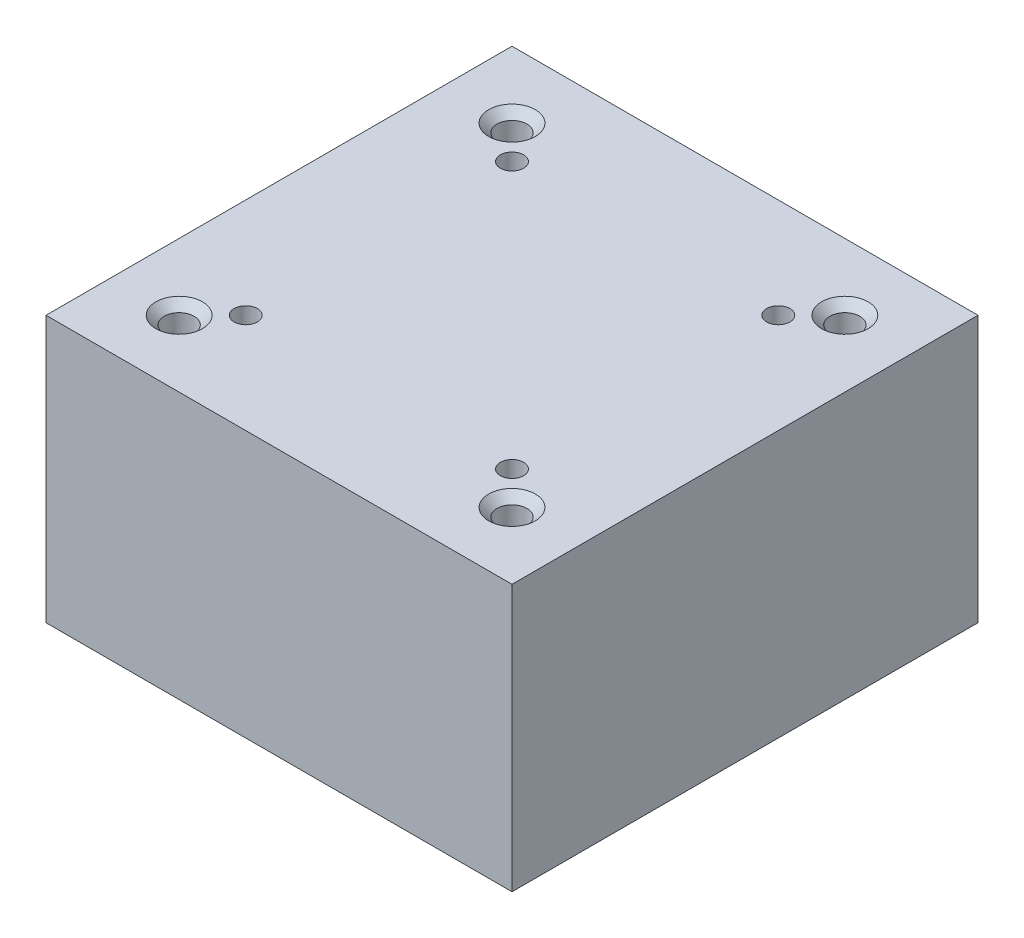
ISO-10303-21;
HEADER;
FILE_DESCRIPTION(('STEP AP214'),'2;1');
FILE_NAME('part.step','',(''),(''),'','','');
FILE_SCHEMA(('AUTOMOTIVE_DESIGN { 1 0 10303 214 1 1 1 1 }'));
ENDSEC;
DATA;
#1=APPLICATION_CONTEXT('core data for automotive mechanical design processes');
#2=APPLICATION_PROTOCOL_DEFINITION('international standard','automotive_design',2000,#1);
#3=PRODUCT_CONTEXT('',#1,'mechanical');
#4=PRODUCT('Part','Part','',(#3));
#5=PRODUCT_RELATED_PRODUCT_CATEGORY('part','',(#4));
#6=PRODUCT_DEFINITION_FORMATION('','',#4);
#7=PRODUCT_DEFINITION_CONTEXT('part definition',#1,'design');
#8=PRODUCT_DEFINITION('design','',#6,#7);
#9=PRODUCT_DEFINITION_SHAPE('','',#8);
#10=(LENGTH_UNIT() NAMED_UNIT(*) SI_UNIT(.MILLI.,.METRE.));
#11=(NAMED_UNIT(*) PLANE_ANGLE_UNIT() SI_UNIT($,.RADIAN.));
#12=(NAMED_UNIT(*) SI_UNIT($,.STERADIAN.) SOLID_ANGLE_UNIT());
#13=UNCERTAINTY_MEASURE_WITH_UNIT(LENGTH_MEASURE(1.E-05),#10,'distance_accuracy_value','');
#14=(GEOMETRIC_REPRESENTATION_CONTEXT(3) GLOBAL_UNCERTAINTY_ASSIGNED_CONTEXT((#13)) GLOBAL_UNIT_ASSIGNED_CONTEXT((#10,
#11,#12)) REPRESENTATION_CONTEXT('',''));
#15=CARTESIAN_POINT('',(0.,0.,0.));
#16=DIRECTION('',(0.,0.,1.));
#17=DIRECTION('',(1.,0.,0.));
#18=AXIS2_PLACEMENT_3D('',#15,#16,#17);
#19=CARTESIAN_POINT('',(-70.,80.,-70.));
#20=DIRECTION('',(1.,0.,0.));
#21=DIRECTION('',(0.,0.,-1.));
#22=AXIS2_PLACEMENT_3D('',#19,#20,#21);
#23=PLANE('',#22);
#24=DIRECTION('',(0.,0.,1.));
#25=VECTOR('',#24,1.);
#26=CARTESIAN_POINT('',(-70.,0.,-70.));
#27=LINE('',#26,#25);
#28=CARTESIAN_POINT('',(-70.,0.,-70.));
#29=VERTEX_POINT('',#28);
#30=CARTESIAN_POINT('',(-70.,0.,70.));
#31=VERTEX_POINT('',#30);
#32=EDGE_CURVE('E172',#29,#31,#27,.T.);
#33=ORIENTED_EDGE('',*,*,#32,.T.);
#34=DIRECTION('',(0.,-1.,0.));
#35=VECTOR('',#34,1.);
#36=CARTESIAN_POINT('',(-70.,80.,70.));
#37=LINE('',#36,#35);
#38=CARTESIAN_POINT('',(-70.,80.,70.));
#39=VERTEX_POINT('',#38);
#40=EDGE_CURVE('E11',#39,#31,#37,.T.);
#41=ORIENTED_EDGE('',*,*,#40,.F.);
#42=DIRECTION('',(0.,0.,1.));
#43=VECTOR('',#42,1.);
#44=CARTESIAN_POINT('',(-70.,80.,-70.));
#45=LINE('',#44,#43);
#46=CARTESIAN_POINT('',(-70.,80.,-70.));
#47=VERTEX_POINT('',#46);
#48=EDGE_CURVE('E174',#47,#39,#45,.T.);
#49=ORIENTED_EDGE('',*,*,#48,.F.);
#50=DIRECTION('',(0.,-1.,0.));
#51=VECTOR('',#50,1.);
#52=CARTESIAN_POINT('',(-70.,80.,-70.));
#53=LINE('',#52,#51);
#54=EDGE_CURVE('E181',#47,#29,#53,.T.);
#55=ORIENTED_EDGE('',*,*,#54,.T.);
#56=EDGE_LOOP('',(#33,#41,#49,#55));
#57=FACE_BOUND('',#56,.T.);
#58=ADVANCED_FACE('F44',(#57),#23,.F.);
#59=CARTESIAN_POINT('',(-70.,80.,70.));
#60=DIRECTION('',(0.,0.,-1.));
#61=DIRECTION('',(-1.,0.,0.));
#62=AXIS2_PLACEMENT_3D('',#59,#60,#61);
#63=PLANE('',#62);
#64=DIRECTION('',(1.,0.,0.));
#65=VECTOR('',#64,1.);
#66=CARTESIAN_POINT('',(-70.,0.,70.));
#67=LINE('',#66,#65);
#68=CARTESIAN_POINT('',(70.,0.,70.));
#69=VERTEX_POINT('',#68);
#70=EDGE_CURVE('E183',#31,#69,#67,.T.);
#71=ORIENTED_EDGE('',*,*,#70,.T.);
#72=DIRECTION('',(0.,-1.,0.));
#73=VECTOR('',#72,1.);
#74=CARTESIAN_POINT('',(70.,80.,70.));
#75=LINE('',#74,#73);
#76=CARTESIAN_POINT('',(70.,80.,70.));
#77=VERTEX_POINT('',#76);
#78=EDGE_CURVE('E52',#77,#69,#75,.T.);
#79=ORIENTED_EDGE('',*,*,#78,.F.);
#80=DIRECTION('',(1.,0.,0.));
#81=VECTOR('',#80,1.);
#82=CARTESIAN_POINT('',(-70.,80.,70.));
#83=LINE('',#82,#81);
#84=EDGE_CURVE('E95',#39,#77,#83,.T.);
#85=ORIENTED_EDGE('',*,*,#84,.F.);
#86=ORIENTED_EDGE('',*,*,#40,.T.);
#87=EDGE_LOOP('',(#71,#79,#85,#86));
#88=FACE_BOUND('',#87,.T.);
#89=ADVANCED_FACE('F209',(#88),#63,.F.);
#90=CARTESIAN_POINT('',(70.,80.,-70.));
#91=DIRECTION('',(-1.,0.,0.));
#92=DIRECTION('',(0.,0.,1.));
#93=AXIS2_PLACEMENT_3D('',#90,#91,#92);
#94=PLANE('',#93);
#95=DIRECTION('',(0.,0.,-1.));
#96=VECTOR('',#95,1.);
#97=CARTESIAN_POINT('',(70.,0.,-70.));
#98=LINE('',#97,#96);
#99=CARTESIAN_POINT('',(70.,0.,-70.));
#100=VERTEX_POINT('',#99);
#101=EDGE_CURVE('E79',#69,#100,#98,.T.);
#102=ORIENTED_EDGE('',*,*,#101,.T.);
#103=DIRECTION('',(0.,-1.,0.));
#104=VECTOR('',#103,1.);
#105=CARTESIAN_POINT('',(70.,80.,-70.));
#106=LINE('',#105,#104);
#107=CARTESIAN_POINT('',(70.,80.,-70.));
#108=VERTEX_POINT('',#107);
#109=EDGE_CURVE('E186',#108,#100,#106,.T.);
#110=ORIENTED_EDGE('',*,*,#109,.F.);
#111=DIRECTION('',(0.,0.,-1.));
#112=VECTOR('',#111,1.);
#113=CARTESIAN_POINT('',(70.,80.,-70.));
#114=LINE('',#113,#112);
#115=EDGE_CURVE('E178',#77,#108,#114,.T.);
#116=ORIENTED_EDGE('',*,*,#115,.F.);
#117=ORIENTED_EDGE('',*,*,#78,.T.);
#118=EDGE_LOOP('',(#102,#110,#116,#117));
#119=FACE_BOUND('',#118,.T.);
#120=ADVANCED_FACE('F191',(#119),#94,.F.);
#121=CARTESIAN_POINT('',(-70.,80.,-70.));
#122=DIRECTION('',(0.,0.,1.));
#123=DIRECTION('',(1.,0.,0.));
#124=AXIS2_PLACEMENT_3D('',#121,#122,#123);
#125=PLANE('',#124);
#126=DIRECTION('',(-1.,0.,0.));
#127=VECTOR('',#126,1.);
#128=CARTESIAN_POINT('',(-70.,0.,-70.));
#129=LINE('',#128,#127);
#130=EDGE_CURVE('E85',#100,#29,#129,.T.);
#131=ORIENTED_EDGE('',*,*,#130,.T.);
#132=ORIENTED_EDGE('',*,*,#54,.F.);
#133=DIRECTION('',(-1.,0.,0.));
#134=VECTOR('',#133,1.);
#135=CARTESIAN_POINT('',(-70.,80.,-70.));
#136=LINE('',#135,#134);
#137=EDGE_CURVE('E61',#108,#47,#136,.T.);
#138=ORIENTED_EDGE('',*,*,#137,.F.);
#139=ORIENTED_EDGE('',*,*,#109,.T.);
#140=EDGE_LOOP('',(#131,#132,#138,#139));
#141=FACE_BOUND('',#140,.T.);
#142=ADVANCED_FACE('F198',(#141),#125,.F.);
#143=CARTESIAN_POINT('',(0.,80.,0.));
#144=DIRECTION('',(0.,1.,0.));
#145=DIRECTION('',(0.,0.,1.));
#146=AXIS2_PLACEMENT_3D('',#143,#144,#145);
#147=PLANE('',#146);
#148=CARTESIAN_POINT('',(-40.,80.,40.));
#149=DIRECTION('',(0.,1.,0.));
#150=DIRECTION('',(0.,0.,1.));
#151=AXIS2_PLACEMENT_3D('',#148,#149,#150);
#152=CIRCLE('',#151,3.49999999999999);
#153=CARTESIAN_POINT('',(-40.,80.,43.5));
#154=VERTEX_POINT('',#153);
#155=EDGE_CURVE('E116',#154,#154,#152,.T.);
#156=ORIENTED_EDGE('',*,*,#155,.F.);
#157=EDGE_LOOP('',(#156));
#158=FACE_BOUND('',#157,.T.);
#159=CARTESIAN_POINT('',(40.,80.,-40.));
#160=DIRECTION('',(0.,1.,0.));
#161=DIRECTION('',(0.,0.,1.));
#162=AXIS2_PLACEMENT_3D('',#159,#160,#161);
#163=CIRCLE('',#162,3.49999999999999);
#164=CARTESIAN_POINT('',(40.,80.,-36.5));
#165=VERTEX_POINT('',#164);
#166=EDGE_CURVE('E114',#165,#165,#163,.T.);
#167=ORIENTED_EDGE('',*,*,#166,.F.);
#168=EDGE_LOOP('',(#167));
#169=FACE_BOUND('',#168,.T.);
#170=CARTESIAN_POINT('',(-40.,80.,-40.));
#171=DIRECTION('',(0.,1.,0.));
#172=DIRECTION('',(0.,0.,1.));
#173=AXIS2_PLACEMENT_3D('',#170,#171,#172);
#174=CIRCLE('',#173,3.49999999999999);
#175=CARTESIAN_POINT('',(-40.,80.,-36.5));
#176=VERTEX_POINT('',#175);
#177=EDGE_CURVE('E126',#176,#176,#174,.T.);
#178=ORIENTED_EDGE('',*,*,#177,.F.);
#179=EDGE_LOOP('',(#178));
#180=FACE_BOUND('',#179,.T.);
#181=CARTESIAN_POINT('',(40.,80.,40.));
#182=DIRECTION('',(0.,1.,0.));
#183=DIRECTION('',(0.,0.,1.));
#184=AXIS2_PLACEMENT_3D('',#181,#182,#183);
#185=CIRCLE('',#184,3.49999999999999);
#186=CARTESIAN_POINT('',(40.,80.,43.5));
#187=VERTEX_POINT('',#186);
#188=EDGE_CURVE('E135',#187,#187,#185,.T.);
#189=ORIENTED_EDGE('',*,*,#188,.F.);
#190=EDGE_LOOP('',(#189));
#191=FACE_BOUND('',#190,.T.);
#192=CARTESIAN_POINT('',(-50.,80.,50.));
#193=DIRECTION('',(0.,1.,0.));
#194=DIRECTION('',(0.,0.,1.));
#195=AXIS2_PLACEMENT_3D('',#192,#193,#194);
#196=CIRCLE('',#195,7.);
#197=CARTESIAN_POINT('',(-50.,80.,57.));
#198=VERTEX_POINT('',#197);
#199=EDGE_CURVE('E139',#198,#198,#196,.T.);
#200=ORIENTED_EDGE('',*,*,#199,.F.);
#201=EDGE_LOOP('',(#200));
#202=FACE_BOUND('',#201,.T.);
#203=CARTESIAN_POINT('',(50.,80.,-50.));
#204=DIRECTION('',(0.,1.,0.));
#205=DIRECTION('',(0.,0.,1.));
#206=AXIS2_PLACEMENT_3D('',#203,#204,#205);
#207=CIRCLE('',#206,7.);
#208=CARTESIAN_POINT('',(50.,80.,-43.));
#209=VERTEX_POINT('',#208);
#210=EDGE_CURVE('E147',#209,#209,#207,.T.);
#211=ORIENTED_EDGE('',*,*,#210,.F.);
#212=EDGE_LOOP('',(#211));
#213=FACE_BOUND('',#212,.T.);
#214=CARTESIAN_POINT('',(-50.,80.,-50.));
#215=DIRECTION('',(0.,1.,0.));
#216=DIRECTION('',(0.,0.,1.));
#217=AXIS2_PLACEMENT_3D('',#214,#215,#216);
#218=CIRCLE('',#217,7.);
#219=CARTESIAN_POINT('',(-50.,80.,-43.));
#220=VERTEX_POINT('',#219);
#221=EDGE_CURVE('E157',#220,#220,#218,.T.);
#222=ORIENTED_EDGE('',*,*,#221,.F.);
#223=EDGE_LOOP('',(#222));
#224=FACE_BOUND('',#223,.T.);
#225=CARTESIAN_POINT('',(50.,80.,50.));
#226=DIRECTION('',(0.,1.,0.));
#227=DIRECTION('',(0.,0.,1.));
#228=AXIS2_PLACEMENT_3D('',#225,#226,#227);
#229=CIRCLE('',#228,7.);
#230=CARTESIAN_POINT('',(50.,80.,57.));
#231=VERTEX_POINT('',#230);
#232=EDGE_CURVE('E164',#231,#231,#229,.T.);
#233=ORIENTED_EDGE('',*,*,#232,.F.);
#234=EDGE_LOOP('',(#233));
#235=FACE_BOUND('',#234,.T.);
#236=ORIENTED_EDGE('',*,*,#48,.T.);
#237=ORIENTED_EDGE('',*,*,#84,.T.);
#238=ORIENTED_EDGE('',*,*,#115,.T.);
#239=ORIENTED_EDGE('',*,*,#137,.T.);
#240=EDGE_LOOP('',(#236,#237,#238,#239));
#241=FACE_BOUND('',#240,.T.);
#242=ADVANCED_FACE('F199',(#158,#169,#180,#191,#202,#213,#224,#235,#241),#147,.T.);
#243=CARTESIAN_POINT('',(0.,0.,0.));
#244=DIRECTION('',(0.,1.,0.));
#245=DIRECTION('',(0.,0.,1.));
#246=AXIS2_PLACEMENT_3D('',#243,#244,#245);
#247=PLANE('',#246);
#248=CARTESIAN_POINT('',(-50.,0.,50.));
#249=DIRECTION('',(0.,1.,0.));
#250=DIRECTION('',(0.,0.,1.));
#251=AXIS2_PLACEMENT_3D('',#248,#249,#250);
#252=CIRCLE('',#251,4.49999999999999);
#253=CARTESIAN_POINT('',(-50.,0.,54.5));
#254=VERTEX_POINT('',#253);
#255=EDGE_CURVE('E144',#254,#254,#252,.T.);
#256=ORIENTED_EDGE('',*,*,#255,.T.);
#257=EDGE_LOOP('',(#256));
#258=FACE_BOUND('',#257,.T.);
#259=CARTESIAN_POINT('',(50.,0.,-50.));
#260=DIRECTION('',(0.,1.,0.));
#261=DIRECTION('',(0.,0.,1.));
#262=AXIS2_PLACEMENT_3D('',#259,#260,#261);
#263=CIRCLE('',#262,4.49999999999999);
#264=CARTESIAN_POINT('',(50.,0.,-45.5));
#265=VERTEX_POINT('',#264);
#266=EDGE_CURVE('E153',#265,#265,#263,.T.);
#267=ORIENTED_EDGE('',*,*,#266,.T.);
#268=EDGE_LOOP('',(#267));
#269=FACE_BOUND('',#268,.T.);
#270=CARTESIAN_POINT('',(-50.,0.,-50.));
#271=DIRECTION('',(0.,1.,0.));
#272=DIRECTION('',(0.,0.,1.));
#273=AXIS2_PLACEMENT_3D('',#270,#271,#272);
#274=CIRCLE('',#273,4.49999999999999);
#275=CARTESIAN_POINT('',(-50.,0.,-45.5));
#276=VERTEX_POINT('',#275);
#277=EDGE_CURVE('E162',#276,#276,#274,.T.);
#278=ORIENTED_EDGE('',*,*,#277,.T.);
#279=EDGE_LOOP('',(#278));
#280=FACE_BOUND('',#279,.T.);
#281=CARTESIAN_POINT('',(50.,0.,50.));
#282=DIRECTION('',(0.,1.,0.));
#283=DIRECTION('',(0.,0.,1.));
#284=AXIS2_PLACEMENT_3D('',#281,#282,#283);
#285=CIRCLE('',#284,4.49999999999999);
#286=CARTESIAN_POINT('',(50.,0.,54.5));
#287=VERTEX_POINT('',#286);
#288=EDGE_CURVE('E171',#287,#287,#285,.T.);
#289=ORIENTED_EDGE('',*,*,#288,.T.);
#290=EDGE_LOOP('',(#289));
#291=FACE_BOUND('',#290,.T.);
#292=ORIENTED_EDGE('',*,*,#32,.F.);
#293=ORIENTED_EDGE('',*,*,#130,.F.);
#294=ORIENTED_EDGE('',*,*,#101,.F.);
#295=ORIENTED_EDGE('',*,*,#70,.F.);
#296=EDGE_LOOP('',(#292,#293,#294,#295));
#297=FACE_BOUND('',#296,.T.);
#298=ADVANCED_FACE('F193',(#258,#269,#280,#291,#297),#247,.F.);
#299=CARTESIAN_POINT('',(50.,80.,50.));
#300=DIRECTION('',(0.,1.,0.));
#301=DIRECTION('',(0.,0.,1.));
#302=AXIS2_PLACEMENT_3D('',#299,#300,#301);
#303=CYLINDRICAL_SURFACE('',#302,4.49999999999999);
#304=ORIENTED_EDGE('',*,*,#288,.F.);
#305=EDGE_LOOP('',(#304));
#306=FACE_BOUND('',#305,.T.);
#307=CARTESIAN_POINT('',(50.,77.5,50.));
#308=DIRECTION('',(0.,1.,0.));
#309=DIRECTION('',(0.,0.,1.));
#310=AXIS2_PLACEMENT_3D('',#307,#308,#309);
#311=CIRCLE('',#310,4.49999999999999);
#312=CARTESIAN_POINT('',(50.,77.5,54.5));
#313=VERTEX_POINT('',#312);
#314=EDGE_CURVE('E166',#313,#313,#311,.T.);
#315=ORIENTED_EDGE('',*,*,#314,.T.);
#316=EDGE_LOOP('',(#315));
#317=FACE_BOUND('',#316,.T.);
#318=ADVANCED_FACE('F246',(#306,#317),#303,.F.);
#319=CARTESIAN_POINT('',(50.,80.,50.));
#320=DIRECTION('',(0.,1.,0.));
#321=DIRECTION('',(0.,0.,1.));
#322=AXIS2_PLACEMENT_3D('',#319,#320,#321);
#323=CONICAL_SURFACE('',#322,7.,0.785398163397452);
#324=ORIENTED_EDGE('',*,*,#314,.F.);
#325=EDGE_LOOP('',(#324));
#326=FACE_BOUND('',#325,.T.);
#327=ORIENTED_EDGE('',*,*,#232,.T.);
#328=EDGE_LOOP('',(#327));
#329=FACE_BOUND('',#328,.T.);
#330=ADVANCED_FACE('F253',(#326,#329),#323,.F.);
#331=CARTESIAN_POINT('',(-50.,80.,-50.));
#332=DIRECTION('',(0.,1.,0.));
#333=DIRECTION('',(0.,0.,1.));
#334=AXIS2_PLACEMENT_3D('',#331,#332,#333);
#335=CYLINDRICAL_SURFACE('',#334,4.49999999999999);
#336=ORIENTED_EDGE('',*,*,#277,.F.);
#337=EDGE_LOOP('',(#336));
#338=FACE_BOUND('',#337,.T.);
#339=CARTESIAN_POINT('',(-50.,77.5,-50.));
#340=DIRECTION('',(0.,1.,0.));
#341=DIRECTION('',(0.,0.,1.));
#342=AXIS2_PLACEMENT_3D('',#339,#340,#341);
#343=CIRCLE('',#342,4.49999999999999);
#344=CARTESIAN_POINT('',(-50.,77.5,-45.5));
#345=VERTEX_POINT('',#344);
#346=EDGE_CURVE('E156',#345,#345,#343,.T.);
#347=ORIENTED_EDGE('',*,*,#346,.T.);
#348=EDGE_LOOP('',(#347));
#349=FACE_BOUND('',#348,.T.);
#350=ADVANCED_FACE('F264',(#338,#349),#335,.F.);
#351=CARTESIAN_POINT('',(-50.,80.,-50.));
#352=DIRECTION('',(0.,1.,0.));
#353=DIRECTION('',(0.,0.,1.));
#354=AXIS2_PLACEMENT_3D('',#351,#352,#353);
#355=CONICAL_SURFACE('',#354,7.,0.785398163397452);
#356=ORIENTED_EDGE('',*,*,#346,.F.);
#357=EDGE_LOOP('',(#356));
#358=FACE_BOUND('',#357,.T.);
#359=ORIENTED_EDGE('',*,*,#221,.T.);
#360=EDGE_LOOP('',(#359));
#361=FACE_BOUND('',#360,.T.);
#362=ADVANCED_FACE('F273',(#358,#361),#355,.F.);
#363=CARTESIAN_POINT('',(50.,80.,-50.));
#364=DIRECTION('',(0.,1.,0.));
#365=DIRECTION('',(0.,0.,1.));
#366=AXIS2_PLACEMENT_3D('',#363,#364,#365);
#367=CYLINDRICAL_SURFACE('',#366,4.49999999999999);
#368=ORIENTED_EDGE('',*,*,#266,.F.);
#369=EDGE_LOOP('',(#368));
#370=FACE_BOUND('',#369,.T.);
#371=CARTESIAN_POINT('',(50.,77.5,-50.));
#372=DIRECTION('',(0.,1.,0.));
#373=DIRECTION('',(0.,0.,1.));
#374=AXIS2_PLACEMENT_3D('',#371,#372,#373);
#375=CIRCLE('',#374,4.49999999999999);
#376=CARTESIAN_POINT('',(50.,77.5,-45.5));
#377=VERTEX_POINT('',#376);
#378=EDGE_CURVE('E150',#377,#377,#375,.T.);
#379=ORIENTED_EDGE('',*,*,#378,.T.);
#380=EDGE_LOOP('',(#379));
#381=FACE_BOUND('',#380,.T.);
#382=ADVANCED_FACE('F284',(#370,#381),#367,.F.);
#383=CARTESIAN_POINT('',(50.,80.,-50.));
#384=DIRECTION('',(0.,1.,0.));
#385=DIRECTION('',(0.,0.,1.));
#386=AXIS2_PLACEMENT_3D('',#383,#384,#385);
#387=CONICAL_SURFACE('',#386,7.,0.785398163397452);
#388=ORIENTED_EDGE('',*,*,#378,.F.);
#389=EDGE_LOOP('',(#388));
#390=FACE_BOUND('',#389,.T.);
#391=ORIENTED_EDGE('',*,*,#210,.T.);
#392=EDGE_LOOP('',(#391));
#393=FACE_BOUND('',#392,.T.);
#394=ADVANCED_FACE('F294',(#390,#393),#387,.F.);
#395=CARTESIAN_POINT('',(-50.,80.,50.));
#396=DIRECTION('',(0.,1.,0.));
#397=DIRECTION('',(0.,0.,1.));
#398=AXIS2_PLACEMENT_3D('',#395,#396,#397);
#399=CYLINDRICAL_SURFACE('',#398,4.49999999999999);
#400=ORIENTED_EDGE('',*,*,#255,.F.);
#401=EDGE_LOOP('',(#400));
#402=FACE_BOUND('',#401,.T.);
#403=CARTESIAN_POINT('',(-50.,77.5,50.));
#404=DIRECTION('',(0.,1.,0.));
#405=DIRECTION('',(0.,0.,1.));
#406=AXIS2_PLACEMENT_3D('',#403,#404,#405);
#407=CIRCLE('',#406,4.49999999999999);
#408=CARTESIAN_POINT('',(-50.,77.5,54.5));
#409=VERTEX_POINT('',#408);
#410=EDGE_CURVE('E142',#409,#409,#407,.T.);
#411=ORIENTED_EDGE('',*,*,#410,.T.);
#412=EDGE_LOOP('',(#411));
#413=FACE_BOUND('',#412,.T.);
#414=ADVANCED_FACE('F304',(#402,#413),#399,.F.);
#415=CARTESIAN_POINT('',(-50.,80.,50.));
#416=DIRECTION('',(0.,1.,0.));
#417=DIRECTION('',(0.,0.,1.));
#418=AXIS2_PLACEMENT_3D('',#415,#416,#417);
#419=CONICAL_SURFACE('',#418,7.,0.785398163397452);
#420=ORIENTED_EDGE('',*,*,#410,.F.);
#421=EDGE_LOOP('',(#420));
#422=FACE_BOUND('',#421,.T.);
#423=ORIENTED_EDGE('',*,*,#199,.T.);
#424=EDGE_LOOP('',(#423));
#425=FACE_BOUND('',#424,.T.);
#426=ADVANCED_FACE('F314',(#422,#425),#419,.F.);
#427=CARTESIAN_POINT('',(40.,64.,40.));
#428=DIRECTION('',(0.,1.,0.));
#429=DIRECTION('',(0.,0.,1.));
#430=AXIS2_PLACEMENT_3D('',#427,#428,#429);
#431=CONICAL_SURFACE('',#430,3.5,1.02974425867665);
#432=CARTESIAN_POINT('',(40.,61.8969878334035,40.));
#433=VERTEX_POINT('',#432);
#434=VERTEX_LOOP('',#433);
#435=FACE_BOUND('',#434,.T.);
#436=CARTESIAN_POINT('',(40.,64.,40.));
#437=DIRECTION('',(0.,1.,0.));
#438=DIRECTION('',(0.,0.,1.));
#439=AXIS2_PLACEMENT_3D('',#436,#437,#438);
#440=CIRCLE('',#439,3.5);
#441=CARTESIAN_POINT('',(40.,64.,43.5));
#442=VERTEX_POINT('',#441);
#443=EDGE_CURVE('E134',#442,#442,#440,.T.);
#444=ORIENTED_EDGE('',*,*,#443,.T.);
#445=EDGE_LOOP('',(#444));
#446=FACE_BOUND('',#445,.T.);
#447=ADVANCED_FACE('F323',(#435,#446),#431,.F.);
#448=CARTESIAN_POINT('',(40.,80.,40.));
#449=DIRECTION('',(0.,1.,0.));
#450=DIRECTION('',(0.,0.,1.));
#451=AXIS2_PLACEMENT_3D('',#448,#449,#450);
#452=CYLINDRICAL_SURFACE('',#451,3.49999999999999);
#453=ORIENTED_EDGE('',*,*,#443,.F.);
#454=EDGE_LOOP('',(#453));
#455=FACE_BOUND('',#454,.T.);
#456=ORIENTED_EDGE('',*,*,#188,.T.);
#457=EDGE_LOOP('',(#456));
#458=FACE_BOUND('',#457,.T.);
#459=ADVANCED_FACE('F334',(#455,#458),#452,.F.);
#460=CARTESIAN_POINT('',(-40.,64.,-40.));
#461=DIRECTION('',(0.,1.,0.));
#462=DIRECTION('',(0.,0.,1.));
#463=AXIS2_PLACEMENT_3D('',#460,#461,#462);
#464=CONICAL_SURFACE('',#463,3.5,1.02974425867665);
#465=CARTESIAN_POINT('',(-40.,61.8969878334035,-40.));
#466=VERTEX_POINT('',#465);
#467=VERTEX_LOOP('',#466);
#468=FACE_BOUND('',#467,.T.);
#469=CARTESIAN_POINT('',(-40.,64.,-40.));
#470=DIRECTION('',(0.,1.,0.));
#471=DIRECTION('',(0.,0.,1.));
#472=AXIS2_PLACEMENT_3D('',#469,#470,#471);
#473=CIRCLE('',#472,3.5);
#474=CARTESIAN_POINT('',(-40.,64.,-36.5));
#475=VERTEX_POINT('',#474);
#476=EDGE_CURVE('E128',#475,#475,#473,.T.);
#477=ORIENTED_EDGE('',*,*,#476,.T.);
#478=EDGE_LOOP('',(#477));
#479=FACE_BOUND('',#478,.T.);
#480=ADVANCED_FACE('F343',(#468,#479),#464,.F.);
#481=CARTESIAN_POINT('',(-40.,80.,-40.));
#482=DIRECTION('',(0.,1.,0.));
#483=DIRECTION('',(0.,0.,1.));
#484=AXIS2_PLACEMENT_3D('',#481,#482,#483);
#485=CYLINDRICAL_SURFACE('',#484,3.49999999999999);
#486=ORIENTED_EDGE('',*,*,#476,.F.);
#487=EDGE_LOOP('',(#486));
#488=FACE_BOUND('',#487,.T.);
#489=ORIENTED_EDGE('',*,*,#177,.T.);
#490=EDGE_LOOP('',(#489));
#491=FACE_BOUND('',#490,.T.);
#492=ADVANCED_FACE('F353',(#488,#491),#485,.F.);
#493=CARTESIAN_POINT('',(40.,64.,-40.));
#494=DIRECTION('',(0.,1.,0.));
#495=DIRECTION('',(0.,0.,1.));
#496=AXIS2_PLACEMENT_3D('',#493,#494,#495);
#497=CONICAL_SURFACE('',#496,3.5,1.02974425867665);
#498=CARTESIAN_POINT('',(40.,61.8969878334035,-40.));
#499=VERTEX_POINT('',#498);
#500=VERTEX_LOOP('',#499);
#501=FACE_BOUND('',#500,.T.);
#502=CARTESIAN_POINT('',(40.,64.,-40.));
#503=DIRECTION('',(0.,1.,0.));
#504=DIRECTION('',(0.,0.,1.));
#505=AXIS2_PLACEMENT_3D('',#502,#503,#504);
#506=CIRCLE('',#505,3.5);
#507=CARTESIAN_POINT('',(40.,64.,-36.5));
#508=VERTEX_POINT('',#507);
#509=EDGE_CURVE('E118',#508,#508,#506,.T.);
#510=ORIENTED_EDGE('',*,*,#509,.T.);
#511=EDGE_LOOP('',(#510));
#512=FACE_BOUND('',#511,.T.);
#513=ADVANCED_FACE('F366',(#501,#512),#497,.F.);
#514=CARTESIAN_POINT('',(40.,80.,-40.));
#515=DIRECTION('',(0.,1.,0.));
#516=DIRECTION('',(0.,0.,1.));
#517=AXIS2_PLACEMENT_3D('',#514,#515,#516);
#518=CYLINDRICAL_SURFACE('',#517,3.49999999999999);
#519=ORIENTED_EDGE('',*,*,#509,.F.);
#520=EDGE_LOOP('',(#519));
#521=FACE_BOUND('',#520,.T.);
#522=ORIENTED_EDGE('',*,*,#166,.T.);
#523=EDGE_LOOP('',(#522));
#524=FACE_BOUND('',#523,.T.);
#525=ADVANCED_FACE('F107',(#521,#524),#518,.F.);
#526=CARTESIAN_POINT('',(-40.,64.,40.));
#527=DIRECTION('',(0.,1.,0.));
#528=DIRECTION('',(0.,0.,1.));
#529=AXIS2_PLACEMENT_3D('',#526,#527,#528);
#530=CONICAL_SURFACE('',#529,3.5,1.02974425867665);
#531=CARTESIAN_POINT('',(-40.,61.8969878334035,40.));
#532=VERTEX_POINT('',#531);
#533=VERTEX_LOOP('',#532);
#534=FACE_BOUND('',#533,.T.);
#535=CARTESIAN_POINT('',(-40.,64.,40.));
#536=DIRECTION('',(0.,1.,0.));
#537=DIRECTION('',(0.,0.,1.));
#538=AXIS2_PLACEMENT_3D('',#535,#536,#537);
#539=CIRCLE('',#538,3.5);
#540=CARTESIAN_POINT('',(-40.,64.,43.5));
#541=VERTEX_POINT('',#540);
#542=EDGE_CURVE('E113',#541,#541,#539,.T.);
#543=ORIENTED_EDGE('',*,*,#542,.T.);
#544=EDGE_LOOP('',(#543));
#545=FACE_BOUND('',#544,.T.);
#546=ADVANCED_FACE('F102',(#534,#545),#530,.F.);
#547=CARTESIAN_POINT('',(-40.,80.,40.));
#548=DIRECTION('',(0.,1.,0.));
#549=DIRECTION('',(0.,0.,1.));
#550=AXIS2_PLACEMENT_3D('',#547,#548,#549);
#551=CYLINDRICAL_SURFACE('',#550,3.49999999999999);
#552=ORIENTED_EDGE('',*,*,#542,.F.);
#553=EDGE_LOOP('',(#552));
#554=FACE_BOUND('',#553,.T.);
#555=ORIENTED_EDGE('',*,*,#155,.T.);
#556=EDGE_LOOP('',(#555));
#557=FACE_BOUND('',#556,.T.);
#558=ADVANCED_FACE('F108',(#554,#557),#551,.F.);
#559=CLOSED_SHELL('',(#58,#89,#120,#142,#242,#298,#318,#330,#350,#362,#382,#394,#414,#426,#447,
#459,#480,#492,#513,#525,#546,#558));
#560=MANIFOLD_SOLID_BREP('B2',#559);
#561=ADVANCED_BREP_SHAPE_REPRESENTATION('',(#18,#560),#14);
#562=SHAPE_DEFINITION_REPRESENTATION(#9,#561);
ENDSEC;
END-ISO-10303-21;
